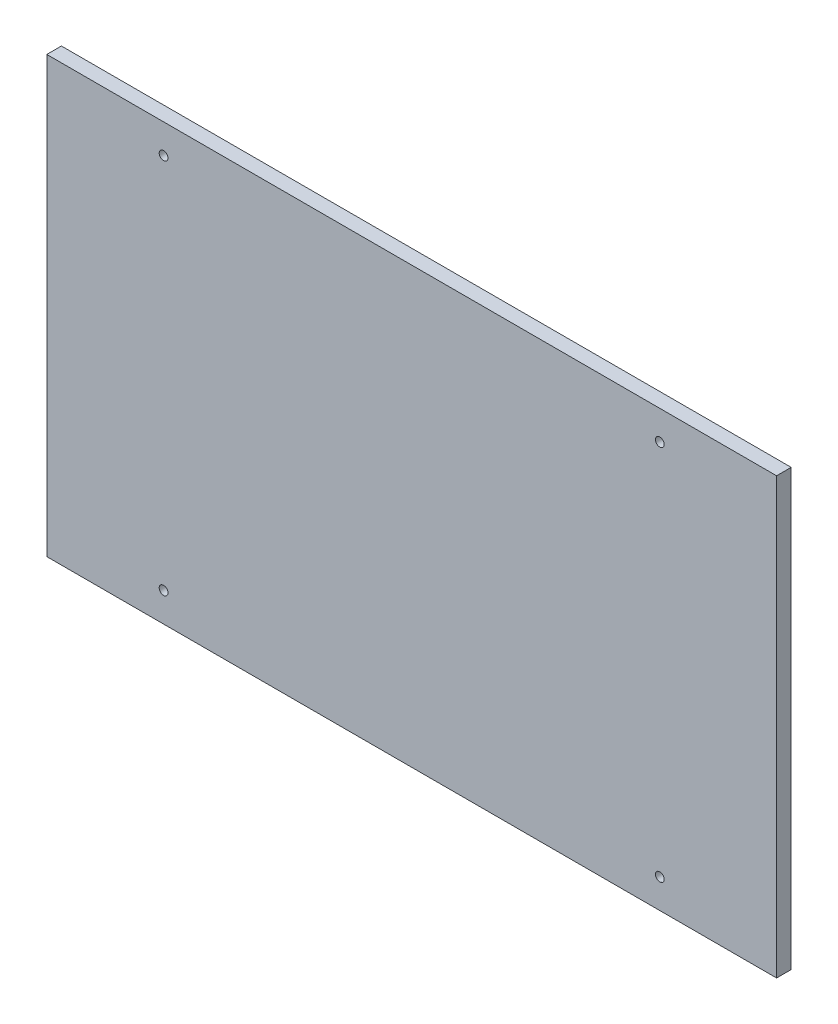
ISO-10303-21;
HEADER;
FILE_DESCRIPTION(('STEP AP214'),'2;1');
FILE_NAME('part.step','',(''),(''),'','','');
FILE_SCHEMA(('AUTOMOTIVE_DESIGN { 1 0 10303 214 1 1 1 1 }'));
ENDSEC;
DATA;
#1=APPLICATION_CONTEXT('core data for automotive mechanical design processes');
#2=APPLICATION_PROTOCOL_DEFINITION('international standard','automotive_design',2000,#1);
#3=PRODUCT_CONTEXT('',#1,'mechanical');
#4=PRODUCT('Part','Part','',(#3));
#5=PRODUCT_RELATED_PRODUCT_CATEGORY('part','',(#4));
#6=PRODUCT_DEFINITION_FORMATION('','',#4);
#7=PRODUCT_DEFINITION_CONTEXT('part definition',#1,'design');
#8=PRODUCT_DEFINITION('design','',#6,#7);
#9=PRODUCT_DEFINITION_SHAPE('','',#8);
#10=(LENGTH_UNIT() NAMED_UNIT(*) SI_UNIT(.MILLI.,.METRE.));
#11=(NAMED_UNIT(*) PLANE_ANGLE_UNIT() SI_UNIT($,.RADIAN.));
#12=(NAMED_UNIT(*) SI_UNIT($,.STERADIAN.) SOLID_ANGLE_UNIT());
#13=UNCERTAINTY_MEASURE_WITH_UNIT(LENGTH_MEASURE(1.E-05),#10,'distance_accuracy_value','');
#14=(GEOMETRIC_REPRESENTATION_CONTEXT(3) GLOBAL_UNCERTAINTY_ASSIGNED_CONTEXT((#13)) GLOBAL_UNIT_ASSIGNED_CONTEXT((#10,
#11,#12)) REPRESENTATION_CONTEXT('',''));
#15=CARTESIAN_POINT('',(0.,0.,0.));
#16=DIRECTION('',(0.,0.,1.));
#17=DIRECTION('',(1.,0.,0.));
#18=AXIS2_PLACEMENT_3D('',#15,#16,#17);
#19=CARTESIAN_POINT('',(0.,0.,5.));
#20=DIRECTION('',(0.,0.,1.));
#21=DIRECTION('',(1.,0.,0.));
#22=AXIS2_PLACEMENT_3D('',#19,#20,#21);
#23=PLANE('',#22);
#24=CARTESIAN_POINT('',(-85.,-64.5,5.));
#25=DIRECTION('',(0.,0.,-1.));
#26=DIRECTION('',(-1.,0.,0.));
#27=AXIS2_PLACEMENT_3D('',#24,#25,#26);
#28=CIRCLE('',#27,1.5);
#29=CARTESIAN_POINT('',(-86.5,-64.5,5.));
#30=VERTEX_POINT('',#29);
#31=EDGE_CURVE('E143',#30,#30,#28,.T.);
#32=ORIENTED_EDGE('',*,*,#31,.T.);
#33=EDGE_LOOP('',(#32));
#34=FACE_BOUND('',#33,.T.);
#35=CARTESIAN_POINT('',(-85.,64.5,5.));
#36=DIRECTION('',(0.,0.,1.));
#37=DIRECTION('',(1.,0.,0.));
#38=AXIS2_PLACEMENT_3D('',#35,#36,#37);
#39=CIRCLE('',#38,1.5);
#40=CARTESIAN_POINT('',(-83.5,64.5,5.));
#41=VERTEX_POINT('',#40);
#42=EDGE_CURVE('E139',#41,#41,#39,.T.);
#43=ORIENTED_EDGE('',*,*,#42,.F.);
#44=EDGE_LOOP('',(#43));
#45=FACE_BOUND('',#44,.T.);
#46=DIRECTION('',(0.,1.,0.));
#47=VECTOR('',#46,1.);
#48=CARTESIAN_POINT('',(125.,74.5,5.));
#49=LINE('',#48,#47);
#50=CARTESIAN_POINT('',(125.,-74.5,5.));
#51=VERTEX_POINT('',#50);
#52=CARTESIAN_POINT('',(125.,74.5,5.));
#53=VERTEX_POINT('',#52);
#54=EDGE_CURVE('E94',#51,#53,#49,.T.);
#55=ORIENTED_EDGE('',*,*,#54,.T.);
#56=DIRECTION('',(-1.,0.,0.));
#57=VECTOR('',#56,1.);
#58=CARTESIAN_POINT('',(-125.,74.5,5.));
#59=LINE('',#58,#57);
#60=CARTESIAN_POINT('',(-125.,74.5,5.));
#61=VERTEX_POINT('',#60);
#62=EDGE_CURVE('E89',#53,#61,#59,.T.);
#63=ORIENTED_EDGE('',*,*,#62,.T.);
#64=DIRECTION('',(0.,-1.,0.));
#65=VECTOR('',#64,1.);
#66=CARTESIAN_POINT('',(-125.,74.5,5.));
#67=LINE('',#66,#65);
#68=CARTESIAN_POINT('',(-125.,-74.5,5.));
#69=VERTEX_POINT('',#68);
#70=EDGE_CURVE('E92',#61,#69,#67,.T.);
#71=ORIENTED_EDGE('',*,*,#70,.T.);
#72=DIRECTION('',(1.,0.,0.));
#73=VECTOR('',#72,1.);
#74=CARTESIAN_POINT('',(-125.,-74.5,5.));
#75=LINE('',#74,#73);
#76=EDGE_CURVE('E59',#69,#51,#75,.T.);
#77=ORIENTED_EDGE('',*,*,#76,.T.);
#78=EDGE_LOOP('',(#55,#63,#71,#77));
#79=FACE_BOUND('',#78,.T.);
#80=CARTESIAN_POINT('',(85.,-64.5,5.));
#81=DIRECTION('',(0.,0.,1.));
#82=DIRECTION('',(1.,0.,0.));
#83=AXIS2_PLACEMENT_3D('',#80,#81,#82);
#84=CIRCLE('',#83,1.5);
#85=CARTESIAN_POINT('',(86.5,-64.5,5.));
#86=VERTEX_POINT('',#85);
#87=EDGE_CURVE('E117',#86,#86,#84,.T.);
#88=ORIENTED_EDGE('',*,*,#87,.F.);
#89=EDGE_LOOP('',(#88));
#90=FACE_BOUND('',#89,.T.);
#91=CARTESIAN_POINT('',(85.,64.5,5.));
#92=DIRECTION('',(0.,0.,-1.));
#93=DIRECTION('',(-1.,0.,0.));
#94=AXIS2_PLACEMENT_3D('',#91,#92,#93);
#95=CIRCLE('',#94,1.5);
#96=CARTESIAN_POINT('',(83.5,64.5,5.));
#97=VERTEX_POINT('',#96);
#98=EDGE_CURVE('E127',#97,#97,#95,.T.);
#99=ORIENTED_EDGE('',*,*,#98,.T.);
#100=EDGE_LOOP('',(#99));
#101=FACE_BOUND('',#100,.T.);
#102=ADVANCED_FACE('F42',(#34,#45,#79,#90,#101),#23,.T.);
#103=CARTESIAN_POINT('',(0.,0.,0.));
#104=DIRECTION('',(0.,0.,1.));
#105=DIRECTION('',(1.,0.,0.));
#106=AXIS2_PLACEMENT_3D('',#103,#104,#105);
#107=PLANE('',#106);
#108=CARTESIAN_POINT('',(85.,-64.5,0.));
#109=DIRECTION('',(0.,0.,1.));
#110=DIRECTION('',(1.,0.,0.));
#111=AXIS2_PLACEMENT_3D('',#108,#109,#110);
#112=CIRCLE('',#111,1.5);
#113=CARTESIAN_POINT('',(86.5,-64.5,0.));
#114=VERTEX_POINT('',#113);
#115=EDGE_CURVE('E124',#114,#114,#112,.T.);
#116=ORIENTED_EDGE('',*,*,#115,.T.);
#117=EDGE_LOOP('',(#116));
#118=FACE_BOUND('',#117,.T.);
#119=CARTESIAN_POINT('',(-85.,64.5,0.));
#120=DIRECTION('',(0.,0.,1.));
#121=DIRECTION('',(1.,0.,0.));
#122=AXIS2_PLACEMENT_3D('',#119,#120,#121);
#123=CIRCLE('',#122,1.5);
#124=CARTESIAN_POINT('',(-83.5,64.5,0.));
#125=VERTEX_POINT('',#124);
#126=EDGE_CURVE('E135',#125,#125,#123,.T.);
#127=ORIENTED_EDGE('',*,*,#126,.T.);
#128=EDGE_LOOP('',(#127));
#129=FACE_BOUND('',#128,.T.);
#130=DIRECTION('',(0.,1.,0.));
#131=VECTOR('',#130,1.);
#132=CARTESIAN_POINT('',(125.,74.5,0.));
#133=LINE('',#132,#131);
#134=CARTESIAN_POINT('',(125.,-74.5,0.));
#135=VERTEX_POINT('',#134);
#136=CARTESIAN_POINT('',(125.,74.5,0.));
#137=VERTEX_POINT('',#136);
#138=EDGE_CURVE('E138',#135,#137,#133,.T.);
#139=ORIENTED_EDGE('',*,*,#138,.F.);
#140=DIRECTION('',(1.,0.,0.));
#141=VECTOR('',#140,1.);
#142=CARTESIAN_POINT('',(-125.,-74.5,0.));
#143=LINE('',#142,#141);
#144=CARTESIAN_POINT('',(-125.,-74.5,0.));
#145=VERTEX_POINT('',#144);
#146=EDGE_CURVE('E82',#145,#135,#143,.T.);
#147=ORIENTED_EDGE('',*,*,#146,.F.);
#148=DIRECTION('',(0.,-1.,0.));
#149=VECTOR('',#148,1.);
#150=CARTESIAN_POINT('',(-125.,74.5,0.));
#151=LINE('',#150,#149);
#152=CARTESIAN_POINT('',(-125.,74.5,0.));
#153=VERTEX_POINT('',#152);
#154=EDGE_CURVE('E76',#153,#145,#151,.T.);
#155=ORIENTED_EDGE('',*,*,#154,.F.);
#156=DIRECTION('',(-1.,0.,0.));
#157=VECTOR('',#156,1.);
#158=CARTESIAN_POINT('',(-125.,74.5,0.));
#159=LINE('',#158,#157);
#160=EDGE_CURVE('E99',#137,#153,#159,.T.);
#161=ORIENTED_EDGE('',*,*,#160,.F.);
#162=EDGE_LOOP('',(#139,#147,#155,#161));
#163=FACE_BOUND('',#162,.T.);
#164=CARTESIAN_POINT('',(-85.,-64.5,0.));
#165=DIRECTION('',(0.,0.,-1.));
#166=DIRECTION('',(-1.,0.,0.));
#167=AXIS2_PLACEMENT_3D('',#164,#165,#166);
#168=CIRCLE('',#167,1.5);
#169=CARTESIAN_POINT('',(-86.5,-64.5,0.));
#170=VERTEX_POINT('',#169);
#171=EDGE_CURVE('E123',#170,#170,#168,.T.);
#172=ORIENTED_EDGE('',*,*,#171,.F.);
#173=EDGE_LOOP('',(#172));
#174=FACE_BOUND('',#173,.T.);
#175=CARTESIAN_POINT('',(85.,64.5,0.));
#176=DIRECTION('',(0.,0.,-1.));
#177=DIRECTION('',(-1.,0.,0.));
#178=AXIS2_PLACEMENT_3D('',#175,#176,#177);
#179=CIRCLE('',#178,1.5);
#180=CARTESIAN_POINT('',(83.5,64.5,0.));
#181=VERTEX_POINT('',#180);
#182=EDGE_CURVE('E132',#181,#181,#179,.T.);
#183=ORIENTED_EDGE('',*,*,#182,.F.);
#184=EDGE_LOOP('',(#183));
#185=FACE_BOUND('',#184,.T.);
#186=ADVANCED_FACE('F158',(#118,#129,#163,#174,#185),#107,.F.);
#187=CARTESIAN_POINT('',(125.,74.5,5.));
#188=DIRECTION('',(-1.,0.,0.));
#189=DIRECTION('',(0.,-1.,0.));
#190=AXIS2_PLACEMENT_3D('',#187,#188,#189);
#191=PLANE('',#190);
#192=ORIENTED_EDGE('',*,*,#138,.T.);
#193=DIRECTION('',(0.,0.,-1.));
#194=VECTOR('',#193,1.);
#195=CARTESIAN_POINT('',(125.,74.5,5.));
#196=LINE('',#195,#194);
#197=EDGE_CURVE('E12',#53,#137,#196,.T.);
#198=ORIENTED_EDGE('',*,*,#197,.F.);
#199=ORIENTED_EDGE('',*,*,#54,.F.);
#200=DIRECTION('',(0.,0.,-1.));
#201=VECTOR('',#200,1.);
#202=CARTESIAN_POINT('',(125.,-74.5,5.));
#203=LINE('',#202,#201);
#204=EDGE_CURVE('E105',#51,#135,#203,.T.);
#205=ORIENTED_EDGE('',*,*,#204,.T.);
#206=EDGE_LOOP('',(#192,#198,#199,#205));
#207=FACE_BOUND('',#206,.T.);
#208=ADVANCED_FACE('F44',(#207),#191,.F.);
#209=CARTESIAN_POINT('',(-125.,74.5,5.));
#210=DIRECTION('',(0.,-1.,0.));
#211=DIRECTION('',(0.,0.,-1.));
#212=AXIS2_PLACEMENT_3D('',#209,#210,#211);
#213=PLANE('',#212);
#214=ORIENTED_EDGE('',*,*,#160,.T.);
#215=DIRECTION('',(0.,0.,-1.));
#216=VECTOR('',#215,1.);
#217=CARTESIAN_POINT('',(-125.,74.5,5.));
#218=LINE('',#217,#216);
#219=EDGE_CURVE('E51',#61,#153,#218,.T.);
#220=ORIENTED_EDGE('',*,*,#219,.F.);
#221=ORIENTED_EDGE('',*,*,#62,.F.);
#222=ORIENTED_EDGE('',*,*,#197,.T.);
#223=EDGE_LOOP('',(#214,#220,#221,#222));
#224=FACE_BOUND('',#223,.T.);
#225=ADVANCED_FACE('F98',(#224),#213,.F.);
#226=CARTESIAN_POINT('',(-125.,74.5,5.));
#227=DIRECTION('',(1.,0.,0.));
#228=DIRECTION('',(0.,0.,-1.));
#229=AXIS2_PLACEMENT_3D('',#226,#227,#228);
#230=PLANE('',#229);
#231=ORIENTED_EDGE('',*,*,#154,.T.);
#232=DIRECTION('',(0.,0.,-1.));
#233=VECTOR('',#232,1.);
#234=CARTESIAN_POINT('',(-125.,-74.5,5.));
#235=LINE('',#234,#233);
#236=EDGE_CURVE('E100',#69,#145,#235,.T.);
#237=ORIENTED_EDGE('',*,*,#236,.F.);
#238=ORIENTED_EDGE('',*,*,#70,.F.);
#239=ORIENTED_EDGE('',*,*,#219,.T.);
#240=EDGE_LOOP('',(#231,#237,#238,#239));
#241=FACE_BOUND('',#240,.T.);
#242=ADVANCED_FACE('F101',(#241),#230,.F.);
#243=CARTESIAN_POINT('',(-125.,-74.5,5.));
#244=DIRECTION('',(0.,1.,0.));
#245=DIRECTION('',(0.,0.,1.));
#246=AXIS2_PLACEMENT_3D('',#243,#244,#245);
#247=PLANE('',#246);
#248=ORIENTED_EDGE('',*,*,#146,.T.);
#249=ORIENTED_EDGE('',*,*,#204,.F.);
#250=ORIENTED_EDGE('',*,*,#76,.F.);
#251=ORIENTED_EDGE('',*,*,#236,.T.);
#252=EDGE_LOOP('',(#248,#249,#250,#251));
#253=FACE_BOUND('',#252,.T.);
#254=ADVANCED_FACE('F180',(#253),#247,.F.);
#255=CARTESIAN_POINT('',(-85.,64.5,0.));
#256=DIRECTION('',(0.,0.,1.));
#257=DIRECTION('',(1.,0.,0.));
#258=AXIS2_PLACEMENT_3D('',#255,#256,#257);
#259=CYLINDRICAL_SURFACE('',#258,1.5);
#260=ORIENTED_EDGE('',*,*,#126,.F.);
#261=EDGE_LOOP('',(#260));
#262=FACE_BOUND('',#261,.T.);
#263=ORIENTED_EDGE('',*,*,#42,.T.);
#264=EDGE_LOOP('',(#263));
#265=FACE_BOUND('',#264,.T.);
#266=ADVANCED_FACE('F178',(#262,#265),#259,.F.);
#267=CARTESIAN_POINT('',(-85.,-64.5,0.));
#268=DIRECTION('',(0.,0.,1.));
#269=DIRECTION('',(1.,0.,0.));
#270=AXIS2_PLACEMENT_3D('',#267,#268,#269);
#271=CYLINDRICAL_SURFACE('',#270,1.5);
#272=ORIENTED_EDGE('',*,*,#171,.T.);
#273=EDGE_LOOP('',(#272));
#274=FACE_BOUND('',#273,.T.);
#275=ORIENTED_EDGE('',*,*,#31,.F.);
#276=EDGE_LOOP('',(#275));
#277=FACE_BOUND('',#276,.T.);
#278=ADVANCED_FACE('F155',(#274,#277),#271,.F.);
#279=CARTESIAN_POINT('',(85.,-64.5,0.));
#280=DIRECTION('',(0.,0.,1.));
#281=DIRECTION('',(1.,0.,0.));
#282=AXIS2_PLACEMENT_3D('',#279,#280,#281);
#283=CYLINDRICAL_SURFACE('',#282,1.5);
#284=ORIENTED_EDGE('',*,*,#115,.F.);
#285=EDGE_LOOP('',(#284));
#286=FACE_BOUND('',#285,.T.);
#287=ORIENTED_EDGE('',*,*,#87,.T.);
#288=EDGE_LOOP('',(#287));
#289=FACE_BOUND('',#288,.T.);
#290=ADVANCED_FACE('F168',(#286,#289),#283,.F.);
#291=CARTESIAN_POINT('',(85.,64.5,0.));
#292=DIRECTION('',(0.,0.,1.));
#293=DIRECTION('',(1.,0.,0.));
#294=AXIS2_PLACEMENT_3D('',#291,#292,#293);
#295=CYLINDRICAL_SURFACE('',#294,1.5);
#296=ORIENTED_EDGE('',*,*,#182,.T.);
#297=EDGE_LOOP('',(#296));
#298=FACE_BOUND('',#297,.T.);
#299=ORIENTED_EDGE('',*,*,#98,.F.);
#300=EDGE_LOOP('',(#299));
#301=FACE_BOUND('',#300,.T.);
#302=ADVANCED_FACE('F165',(#298,#301),#295,.F.);
#303=CLOSED_SHELL('',(#102,#186,#208,#225,#242,#254,#266,#278,#290,#302));
#304=MANIFOLD_SOLID_BREP('B2',#303);
#305=ADVANCED_BREP_SHAPE_REPRESENTATION('',(#18,#304),#14);
#306=SHAPE_DEFINITION_REPRESENTATION(#9,#305);
ENDSEC;
END-ISO-10303-21;
